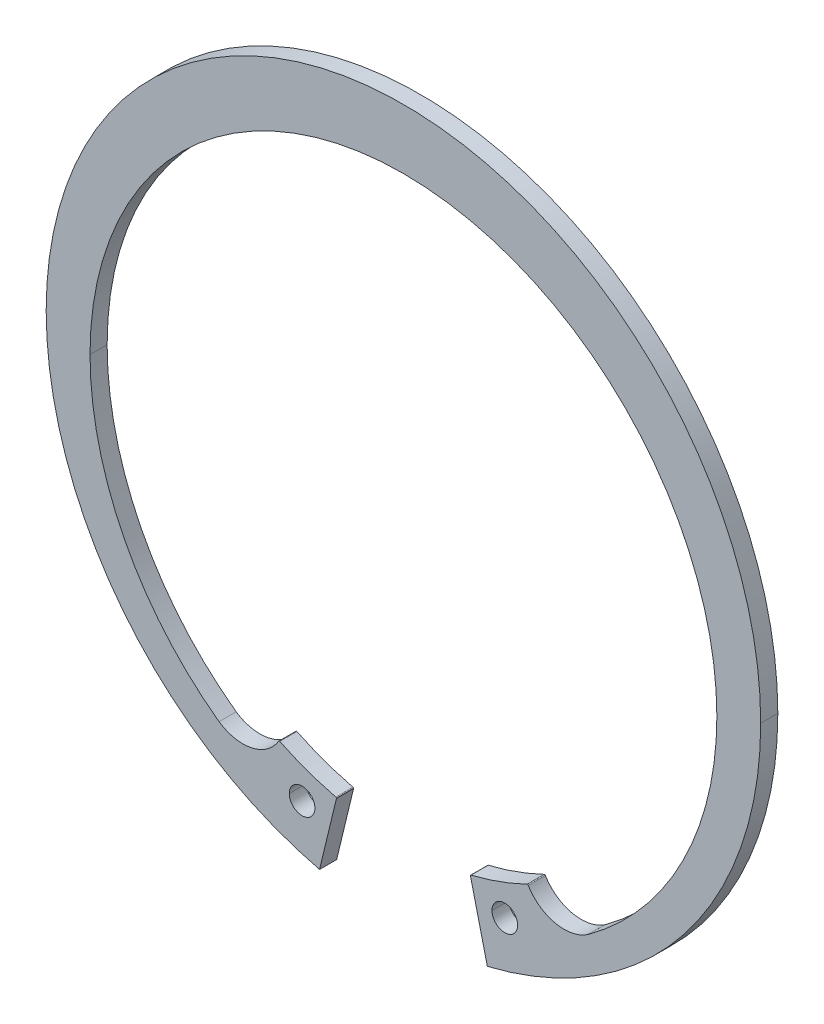
ISO-10303-21;
HEADER;
FILE_DESCRIPTION(('STEP AP214'),'2;1');
FILE_NAME('part.step','',(''),(''),'','','');
FILE_SCHEMA(('AUTOMOTIVE_DESIGN { 1 0 10303 214 1 1 1 1 }'));
ENDSEC;
DATA;
#1=APPLICATION_CONTEXT('core data for automotive mechanical design processes');
#2=APPLICATION_PROTOCOL_DEFINITION('international standard','automotive_design',2000,#1);
#3=PRODUCT_CONTEXT('',#1,'mechanical');
#4=PRODUCT('Part','Part','',(#3));
#5=PRODUCT_RELATED_PRODUCT_CATEGORY('part','',(#4));
#6=PRODUCT_DEFINITION_FORMATION('','',#4);
#7=PRODUCT_DEFINITION_CONTEXT('part definition',#1,'design');
#8=PRODUCT_DEFINITION('design','',#6,#7);
#9=PRODUCT_DEFINITION_SHAPE('','',#8);
#10=(LENGTH_UNIT() NAMED_UNIT(*) SI_UNIT(.MILLI.,.METRE.));
#11=(NAMED_UNIT(*) PLANE_ANGLE_UNIT() SI_UNIT($,.RADIAN.));
#12=(NAMED_UNIT(*) SI_UNIT($,.STERADIAN.) SOLID_ANGLE_UNIT());
#13=UNCERTAINTY_MEASURE_WITH_UNIT(LENGTH_MEASURE(1.E-05),#10,'distance_accuracy_value','');
#14=(GEOMETRIC_REPRESENTATION_CONTEXT(3) GLOBAL_UNCERTAINTY_ASSIGNED_CONTEXT((#13)) GLOBAL_UNIT_ASSIGNED_CONTEXT((#10,
#11,#12)) REPRESENTATION_CONTEXT('',''));
#15=CARTESIAN_POINT('',(0.,0.,0.));
#16=DIRECTION('',(0.,0.,1.));
#17=DIRECTION('',(1.,0.,0.));
#18=AXIS2_PLACEMENT_3D('',#15,#16,#17);
#19=CARTESIAN_POINT('',(-7.9283171314477,-32.3938927494547,-1.99999999999978));
#20=DIRECTION('',(0.,0.,1.));
#21=DIRECTION('',(1.,0.,0.));
#22=AXIS2_PLACEMENT_3D('',#19,#20,#21);
#23=CYLINDRICAL_SURFACE('',#22,0.100000000000003);
#24=DIRECTION('',(0.,0.,1.));
#25=VECTOR('',#24,1.);
#26=CARTESIAN_POINT('',(-7.8283171314477,-32.3938927494543,-1.99999999999978));
#27=LINE('',#26,#25);
#28=CARTESIAN_POINT('',(-7.8283171314477,-32.3938927494543,-1.99999999999978));
#29=VERTEX_POINT('',#28);
#30=CARTESIAN_POINT('',(-7.8283171314477,-32.3938927494547,0.));
#31=VERTEX_POINT('',#30);
#32=EDGE_CURVE('E440',#29,#31,#27,.T.);
#33=ORIENTED_EDGE('',*,*,#32,.F.);
#34=CARTESIAN_POINT('',(-7.9283171314477,-32.3938927494547,-1.99999999999978));
#35=DIRECTION('',(0.,0.,1.));
#36=DIRECTION('',(-1.,0.,0.));
#37=AXIS2_PLACEMENT_3D('',#34,#35,#36);
#38=CIRCLE('',#37,0.100000000000003);
#39=CARTESIAN_POINT('',(-7.90454406658579,-32.2967596377617,-2.00000000000111));
#40=VERTEX_POINT('',#39);
#41=EDGE_CURVE('E373',#29,#40,#38,.T.);
#42=ORIENTED_EDGE('',*,*,#41,.T.);
#43=DIRECTION('',(0.,0.,1.));
#44=VECTOR('',#43,1.);
#45=CARTESIAN_POINT('',(-7.90454406658579,-32.2967596377617,-2.00000000000111));
#46=LINE('',#45,#44);
#47=CARTESIAN_POINT('',(-7.90454406658579,-32.2967596377615,0.));
#48=VERTEX_POINT('',#47);
#49=EDGE_CURVE('E313',#40,#48,#46,.T.);
#50=ORIENTED_EDGE('',*,*,#49,.T.);
#51=CARTESIAN_POINT('',(-7.92831713144771,-32.3938927494547,0.));
#52=DIRECTION('',(0.,0.,1.));
#53=DIRECTION('',(-1.,0.,0.));
#54=AXIS2_PLACEMENT_3D('',#51,#52,#53);
#55=CIRCLE('',#54,0.100000000000003);
#56=EDGE_CURVE('E286',#31,#48,#55,.T.);
#57=ORIENTED_EDGE('',*,*,#56,.F.);
#58=EDGE_LOOP('',(#33,#42,#50,#57));
#59=FACE_BOUND('',#58,.T.);
#60=ADVANCED_FACE('F16',(#59),#23,.T.);
#61=CARTESIAN_POINT('',(-14.4919803074237,-30.0367276308393,-2.00000000000067));
#62=DIRECTION('',(0.,0.,1.));
#63=DIRECTION('',(1.,0.,0.));
#64=AXIS2_PLACEMENT_3D('',#61,#62,#63);
#65=CYLINDRICAL_SURFACE('',#64,0.100000000000005);
#66=CARTESIAN_POINT('',(-14.4919803074237,-30.0367276308384,-4.44089209850063E-13));
#67=DIRECTION('',(0.,0.,1.));
#68=DIRECTION('',(1.,0.,0.));
#69=AXIS2_PLACEMENT_3D('',#66,#67,#68);
#70=CIRCLE('',#69,0.100000000000005);
#71=CARTESIAN_POINT('',(-14.4485260936083,-29.9466624805222,-8.88178419700125E-13));
#72=VERTEX_POINT('',#71);
#73=CARTESIAN_POINT('',(-14.5775096339832,-29.9849132091183,0.));
#74=VERTEX_POINT('',#73);
#75=EDGE_CURVE('E336',#72,#74,#70,.T.);
#76=ORIENTED_EDGE('',*,*,#75,.F.);
#77=DIRECTION('',(0.,0.,1.));
#78=VECTOR('',#77,1.);
#79=CARTESIAN_POINT('',(-14.4485260936083,-29.946662480522,-2.00000000000067));
#80=LINE('',#79,#78);
#81=CARTESIAN_POINT('',(-14.4485260936083,-29.946662480522,-2.00000000000067));
#82=VERTEX_POINT('',#81);
#83=EDGE_CURVE('E306',#82,#72,#80,.T.);
#84=ORIENTED_EDGE('',*,*,#83,.F.);
#85=CARTESIAN_POINT('',(-14.4919803074237,-30.0367276308393,-2.00000000000067));
#86=DIRECTION('',(0.,0.,1.));
#87=DIRECTION('',(1.,0.,0.));
#88=AXIS2_PLACEMENT_3D('',#85,#86,#87);
#89=CIRCLE('',#88,0.100000000000005);
#90=CARTESIAN_POINT('',(-14.5775096339832,-29.9849132091181,-1.99999999999978));
#91=VERTEX_POINT('',#90);
#92=EDGE_CURVE('E347',#82,#91,#89,.T.);
#93=ORIENTED_EDGE('',*,*,#92,.T.);
#94=DIRECTION('',(0.,0.,1.));
#95=VECTOR('',#94,1.);
#96=CARTESIAN_POINT('',(-14.5775096339832,-29.9849132091181,-1.99999999999978));
#97=LINE('',#96,#95);
#98=EDGE_CURVE('E11',#91,#74,#97,.T.);
#99=ORIENTED_EDGE('',*,*,#98,.T.);
#100=EDGE_LOOP('',(#76,#84,#93,#99));
#101=FACE_BOUND('',#100,.T.);
#102=ADVANCED_FACE('F629',(#101),#65,.T.);
#103=CARTESIAN_POINT('',(-18.7741883039646,-27.4425281912447,-2.00000000000067));
#104=DIRECTION('',(0.,0.,1.));
#105=DIRECTION('',(1.,0.,0.));
#106=AXIS2_PLACEMENT_3D('',#103,#104,#105);
#107=CYLINDRICAL_SURFACE('',#106,4.90671309923293);
#108=CARTESIAN_POINT('',(-18.7741883039646,-27.4425281912452,0.));
#109=DIRECTION('',(0.,0.,-1.));
#110=DIRECTION('',(1.,0.,0.));
#111=AXIS2_PLACEMENT_3D('',#108,#109,#110);
#112=CIRCLE('',#111,4.90671309923293);
#113=CARTESIAN_POINT('',(-21.5447012567023,-31.4922308243888,0.));
#114=VERTEX_POINT('',#113);
#115=EDGE_CURVE('E341',#74,#114,#112,.T.);
#116=ORIENTED_EDGE('',*,*,#115,.F.);
#117=ORIENTED_EDGE('',*,*,#98,.F.);
#118=CARTESIAN_POINT('',(-18.7741883039646,-27.4425281912447,-2.00000000000067));
#119=DIRECTION('',(0.,0.,-1.));
#120=DIRECTION('',(1.,0.,0.));
#121=AXIS2_PLACEMENT_3D('',#118,#119,#120);
#122=CIRCLE('',#121,4.90671309923293);
#123=CARTESIAN_POINT('',(-21.5447012567023,-31.4922308243895,-1.99999999999978));
#124=VERTEX_POINT('',#123);
#125=EDGE_CURVE('E265',#91,#124,#122,.T.);
#126=ORIENTED_EDGE('',*,*,#125,.T.);
#127=DIRECTION('',(0.,0.,1.));
#128=VECTOR('',#127,1.);
#129=CARTESIAN_POINT('',(-21.5447012567023,-31.4922308243895,-1.99999999999978));
#130=LINE('',#129,#128);
#131=EDGE_CURVE('E30',#124,#114,#130,.T.);
#132=ORIENTED_EDGE('',*,*,#131,.T.);
#133=EDGE_LOOP('',(#116,#117,#126,#132));
#134=FACE_BOUND('',#133,.T.);
#135=ADVANCED_FACE('F622',(#134),#107,.F.);
#136=CARTESIAN_POINT('',(-23.5736048628727,-34.4579113378789,-2.00000000000067));
#137=DIRECTION('',(-0.825339193721657,0.564637242224496,0.));
#138=DIRECTION('',(0.,0.,1.));
#139=AXIS2_PLACEMENT_3D('',#136,#137,#138);
#140=PLANE('',#139);
#141=DIRECTION('',(-0.564637242224496,-0.825339193721656,0.));
#142=VECTOR('',#141,1.);
#143=CARTESIAN_POINT('',(-23.5736048628727,-34.4579113378789,-2.00000000000067));
#144=LINE('',#143,#142);
#145=CARTESIAN_POINT('',(-21.5460401794114,-31.4941879489048,-1.99999999999978));
#146=VERTEX_POINT('',#145);
#147=EDGE_CURVE('E259',#124,#146,#144,.T.);
#148=ORIENTED_EDGE('',*,*,#147,.T.);
#149=DIRECTION('',(0.,0.,1.));
#150=VECTOR('',#149,1.);
#151=CARTESIAN_POINT('',(-21.5460401794114,-31.4941879489048,-1.99999999999978));
#152=LINE('',#151,#150);
#153=CARTESIAN_POINT('',(-21.5460401794114,-31.4941879489044,-8.88178419700125E-13));
#154=VERTEX_POINT('',#153);
#155=EDGE_CURVE('E256',#146,#154,#152,.T.);
#156=ORIENTED_EDGE('',*,*,#155,.T.);
#157=DIRECTION('',(-0.564637242224496,-0.825339193721656,0.));
#158=VECTOR('',#157,1.);
#159=CARTESIAN_POINT('',(-23.5736048628727,-34.4579113378791,0.));
#160=LINE('',#159,#158);
#161=EDGE_CURVE('E407',#114,#154,#160,.T.);
#162=ORIENTED_EDGE('',*,*,#161,.F.);
#163=ORIENTED_EDGE('',*,*,#131,.F.);
#164=EDGE_LOOP('',(#148,#156,#162,#163));
#165=FACE_BOUND('',#164,.T.);
#166=ADVANCED_FACE('F628',(#165),#140,.T.);
#167=CARTESIAN_POINT('',(0.,2.22044604925031E-13,-1.99999999999978));
#168=DIRECTION('',(0.,0.,1.));
#169=DIRECTION('',(1.,0.,0.));
#170=AXIS2_PLACEMENT_3D('',#167,#168,#169);
#171=CYLINDRICAL_SURFACE('',#170,33.25);
#172=CARTESIAN_POINT('',(0.,0.,0.));
#173=DIRECTION('',(0.,0.,-1.));
#174=DIRECTION('',(1.,0.,0.));
#175=AXIS2_PLACEMENT_3D('',#172,#173,#174);
#176=CIRCLE('',#175,33.25);
#177=EDGE_CURVE('E321',#48,#72,#176,.T.);
#178=ORIENTED_EDGE('',*,*,#177,.F.);
#179=ORIENTED_EDGE('',*,*,#49,.F.);
#180=CARTESIAN_POINT('',(0.,2.22044604925031E-13,-1.99999999999978));
#181=DIRECTION('',(0.,0.,-1.));
#182=DIRECTION('',(1.,0.,0.));
#183=AXIS2_PLACEMENT_3D('',#180,#181,#182);
#184=CIRCLE('',#183,33.25);
#185=EDGE_CURVE('E351',#40,#82,#184,.T.);
#186=ORIENTED_EDGE('',*,*,#185,.T.);
#187=ORIENTED_EDGE('',*,*,#83,.T.);
#188=EDGE_LOOP('',(#178,#179,#186,#187));
#189=FACE_BOUND('',#188,.T.);
#190=ADVANCED_FACE('F788',(#189),#171,.F.);
#191=CARTESIAN_POINT('',(21.5447012567022,-31.4922308243895,-1.99999999999978));
#192=DIRECTION('',(0.825339193721657,0.564637242224496,0.));
#193=DIRECTION('',(0.,0.,-1.));
#194=AXIS2_PLACEMENT_3D('',#191,#192,#193);
#195=PLANE('',#194);
#196=DIRECTION('',(-0.564637242224496,0.825339193721656,0.));
#197=VECTOR('',#196,1.);
#198=CARTESIAN_POINT('',(21.5447012567023,-31.492230824389,-8.88178419700125E-13));
#199=LINE('',#198,#197);
#200=CARTESIAN_POINT('',(21.5460401794114,-31.4941879489041,-8.88178419700125E-13));
#201=VERTEX_POINT('',#200);
#202=CARTESIAN_POINT('',(21.5447012567023,-31.492230824389,-8.88178419700125E-13));
#203=VERTEX_POINT('',#202);
#204=EDGE_CURVE('E142',#201,#203,#199,.T.);
#205=ORIENTED_EDGE('',*,*,#204,.F.);
#206=DIRECTION('',(0.,0.,-1.));
#207=VECTOR('',#206,1.);
#208=CARTESIAN_POINT('',(21.5460401794114,-31.4941879489039,-2.00000000000067));
#209=LINE('',#208,#207);
#210=CARTESIAN_POINT('',(21.5460401794114,-31.4941879489039,-2.00000000000067));
#211=VERTEX_POINT('',#210);
#212=EDGE_CURVE('E307',#201,#211,#209,.T.);
#213=ORIENTED_EDGE('',*,*,#212,.T.);
#214=DIRECTION('',(-0.564637242224496,0.825339193721656,0.));
#215=VECTOR('',#214,1.);
#216=CARTESIAN_POINT('',(21.5447012567022,-31.4922308243895,-1.99999999999978));
#217=LINE('',#216,#215);
#218=CARTESIAN_POINT('',(21.5447012567022,-31.4922308243895,-1.99999999999978));
#219=VERTEX_POINT('',#218);
#220=EDGE_CURVE('E129',#211,#219,#217,.T.);
#221=ORIENTED_EDGE('',*,*,#220,.T.);
#222=DIRECTION('',(0.,0.,1.));
#223=VECTOR('',#222,1.);
#224=CARTESIAN_POINT('',(21.5447012567022,-31.4922308243895,-1.99999999999978));
#225=LINE('',#224,#223);
#226=EDGE_CURVE('E325',#219,#203,#225,.T.);
#227=ORIENTED_EDGE('',*,*,#226,.T.);
#228=EDGE_LOOP('',(#205,#213,#221,#227));
#229=FACE_BOUND('',#228,.T.);
#230=ADVANCED_FACE('F614',(#229),#195,.T.);
#231=CARTESIAN_POINT('',(18.7741883039646,-27.4425281912447,-2.00000000000067));
#232=DIRECTION('',(0.,0.,1.));
#233=DIRECTION('',(1.,0.,0.));
#234=AXIS2_PLACEMENT_3D('',#231,#232,#233);
#235=CYLINDRICAL_SURFACE('',#234,4.90671309923293);
#236=CARTESIAN_POINT('',(18.7741883039646,-27.4425281912445,-8.88178419700125E-13));
#237=DIRECTION('',(0.,0.,-1.));
#238=DIRECTION('',(1.,0.,0.));
#239=AXIS2_PLACEMENT_3D('',#236,#237,#238);
#240=CIRCLE('',#239,4.90671309923293);
#241=CARTESIAN_POINT('',(14.5775096339832,-29.9849132091183,0.));
#242=VERTEX_POINT('',#241);
#243=EDGE_CURVE('E357',#203,#242,#240,.T.);
#244=ORIENTED_EDGE('',*,*,#243,.F.);
#245=ORIENTED_EDGE('',*,*,#226,.F.);
#246=CARTESIAN_POINT('',(18.7741883039646,-27.4425281912447,-2.00000000000067));
#247=DIRECTION('',(0.,0.,-1.));
#248=DIRECTION('',(1.,0.,0.));
#249=AXIS2_PLACEMENT_3D('',#246,#247,#248);
#250=CIRCLE('',#249,4.90671309923293);
#251=CARTESIAN_POINT('',(14.5775096339832,-29.9849132091177,-2.00000000000022));
#252=VERTEX_POINT('',#251);
#253=EDGE_CURVE('E270',#219,#252,#250,.T.);
#254=ORIENTED_EDGE('',*,*,#253,.T.);
#255=DIRECTION('',(0.,0.,1.));
#256=VECTOR('',#255,1.);
#257=CARTESIAN_POINT('',(14.5775096339832,-29.9849132091177,-2.00000000000022));
#258=LINE('',#257,#256);
#259=EDGE_CURVE('E304',#252,#242,#258,.T.);
#260=ORIENTED_EDGE('',*,*,#259,.T.);
#261=EDGE_LOOP('',(#244,#245,#254,#260));
#262=FACE_BOUND('',#261,.T.);
#263=ADVANCED_FACE('F610',(#262),#235,.F.);
#264=CARTESIAN_POINT('',(14.4919803074237,-30.0367276308391,-2.00000000000067));
#265=DIRECTION('',(0.,0.,1.));
#266=DIRECTION('',(1.,0.,0.));
#267=AXIS2_PLACEMENT_3D('',#264,#265,#266);
#268=CYLINDRICAL_SURFACE('',#267,0.100000000000005);
#269=CARTESIAN_POINT('',(14.4919803074237,-30.0367276308386,-4.44089209850063E-13));
#270=DIRECTION('',(0.,0.,1.));
#271=DIRECTION('',(-1.,0.,0.));
#272=AXIS2_PLACEMENT_3D('',#269,#270,#271);
#273=CIRCLE('',#272,0.100000000000005);
#274=CARTESIAN_POINT('',(14.4485260936083,-29.9466624805218,-4.44089209850063E-13));
#275=VERTEX_POINT('',#274);
#276=EDGE_CURVE('E280',#242,#275,#273,.T.);
#277=ORIENTED_EDGE('',*,*,#276,.F.);
#278=ORIENTED_EDGE('',*,*,#259,.F.);
#279=CARTESIAN_POINT('',(14.4919803074237,-30.0367276308391,-2.00000000000067));
#280=DIRECTION('',(0.,0.,1.));
#281=DIRECTION('',(-1.,0.,0.));
#282=AXIS2_PLACEMENT_3D('',#279,#280,#281);
#283=CIRCLE('',#282,0.100000000000005);
#284=CARTESIAN_POINT('',(14.4485260936083,-29.9466624805225,-1.99999999999978));
#285=VERTEX_POINT('',#284);
#286=EDGE_CURVE('E374',#252,#285,#283,.T.);
#287=ORIENTED_EDGE('',*,*,#286,.T.);
#288=DIRECTION('',(0.,0.,1.));
#289=VECTOR('',#288,1.);
#290=CARTESIAN_POINT('',(14.4485260936083,-29.9466624805225,-1.99999999999978));
#291=LINE('',#290,#289);
#292=EDGE_CURVE('E282',#285,#275,#291,.T.);
#293=ORIENTED_EDGE('',*,*,#292,.T.);
#294=EDGE_LOOP('',(#277,#278,#287,#293));
#295=FACE_BOUND('',#294,.T.);
#296=ADVANCED_FACE('F612',(#295),#268,.T.);
#297=CARTESIAN_POINT('',(7.92831713144772,-32.3938927494545,-1.99999999999978));
#298=DIRECTION('',(0.,0.,1.));
#299=DIRECTION('',(1.,0.,0.));
#300=AXIS2_PLACEMENT_3D('',#297,#298,#299);
#301=CYLINDRICAL_SURFACE('',#300,0.0999999999999977);
#302=CARTESIAN_POINT('',(7.92831713144772,-32.3938927494545,-4.44089209850063E-13));
#303=DIRECTION('',(0.,0.,1.));
#304=DIRECTION('',(1.,0.,0.));
#305=AXIS2_PLACEMENT_3D('',#302,#303,#304);
#306=CIRCLE('',#305,0.0999999999999977);
#307=CARTESIAN_POINT('',(7.90454406658581,-32.2967596377626,0.));
#308=VERTEX_POINT('',#307);
#309=CARTESIAN_POINT('',(7.83111317286561,-32.4173744537364,0.));
#310=VERTEX_POINT('',#309);
#311=EDGE_CURVE('E277',#308,#310,#306,.T.);
#312=ORIENTED_EDGE('',*,*,#311,.F.);
#313=DIRECTION('',(0.,0.,1.));
#314=VECTOR('',#313,1.);
#315=CARTESIAN_POINT('',(7.90454406658581,-32.2967596377626,-2.00000000000067));
#316=LINE('',#315,#314);
#317=CARTESIAN_POINT('',(7.90454406658581,-32.2967596377626,-2.00000000000067));
#318=VERTEX_POINT('',#317);
#319=EDGE_CURVE('E285',#318,#308,#316,.T.);
#320=ORIENTED_EDGE('',*,*,#319,.F.);
#321=CARTESIAN_POINT('',(7.92831713144772,-32.3938927494545,-1.99999999999978));
#322=DIRECTION('',(0.,0.,1.));
#323=DIRECTION('',(1.,0.,0.));
#324=AXIS2_PLACEMENT_3D('',#321,#322,#323);
#325=CIRCLE('',#324,0.0999999999999977);
#326=CARTESIAN_POINT('',(7.83111317286561,-32.4173744537357,-2.00000000000067));
#327=VERTEX_POINT('',#326);
#328=EDGE_CURVE('E367',#318,#327,#325,.T.);
#329=ORIENTED_EDGE('',*,*,#328,.T.);
#330=DIRECTION('',(0.,0.,1.));
#331=VECTOR('',#330,1.);
#332=CARTESIAN_POINT('',(7.83111317286561,-32.4173744537357,-2.00000000000067));
#333=LINE('',#332,#331);
#334=EDGE_CURVE('E217',#327,#310,#333,.T.);
#335=ORIENTED_EDGE('',*,*,#334,.T.);
#336=EDGE_LOOP('',(#312,#320,#329,#335));
#337=FACE_BOUND('',#336,.T.);
#338=ADVANCED_FACE('F483',(#337),#301,.T.);
#339=CARTESIAN_POINT('',(0.,2.22044604925031E-13,-1.99999999999978));
#340=DIRECTION('',(0.,0.,1.));
#341=DIRECTION('',(1.,0.,0.));
#342=AXIS2_PLACEMENT_3D('',#339,#340,#341);
#343=CYLINDRICAL_SURFACE('',#342,33.25);
#344=CARTESIAN_POINT('',(0.,0.,0.));
#345=DIRECTION('',(0.,0.,-1.));
#346=DIRECTION('',(1.,0.,0.));
#347=AXIS2_PLACEMENT_3D('',#344,#345,#346);
#348=CIRCLE('',#347,33.25);
#349=EDGE_CURVE('E275',#275,#308,#348,.T.);
#350=ORIENTED_EDGE('',*,*,#349,.F.);
#351=ORIENTED_EDGE('',*,*,#292,.F.);
#352=CARTESIAN_POINT('',(0.,2.22044604925031E-13,-1.99999999999978));
#353=DIRECTION('',(0.,0.,-1.));
#354=DIRECTION('',(1.,0.,0.));
#355=AXIS2_PLACEMENT_3D('',#352,#353,#354);
#356=CIRCLE('',#355,33.25);
#357=EDGE_CURVE('E375',#285,#318,#356,.T.);
#358=ORIENTED_EDGE('',*,*,#357,.T.);
#359=ORIENTED_EDGE('',*,*,#319,.T.);
#360=EDGE_LOOP('',(#350,#351,#358,#359));
#361=FACE_BOUND('',#360,.T.);
#362=ADVANCED_FACE('F487',(#361),#343,.F.);
#363=CARTESIAN_POINT('',(-11.8442150949292,-34.6569645783501,-2.00000000000067));
#364=DIRECTION('',(0.,0.,1.));
#365=DIRECTION('',(1.,0.,0.));
#366=AXIS2_PLACEMENT_3D('',#363,#364,#365);
#367=CYLINDRICAL_SURFACE('',#366,1.5);
#368=DIRECTION('',(0.,0.,1.));
#369=VECTOR('',#368,1.);
#370=CARTESIAN_POINT('',(-13.3442150949292,-34.6569645783508,-2.00000000000067));
#371=LINE('',#370,#369);
#372=CARTESIAN_POINT('',(-13.3442150949292,-34.6569645783508,-2.00000000000067));
#373=VERTEX_POINT('',#372);
#374=CARTESIAN_POINT('',(-13.3442150949292,-34.6569645783505,-8.88178419700125E-13));
#375=VERTEX_POINT('',#374);
#376=EDGE_CURVE('E292',#373,#375,#371,.T.);
#377=ORIENTED_EDGE('',*,*,#376,.F.);
#378=CARTESIAN_POINT('',(-11.8442150949292,-34.6569645783501,-2.00000000000067));
#379=DIRECTION('',(0.,0.,1.));
#380=DIRECTION('',(1.,0.,0.));
#381=AXIS2_PLACEMENT_3D('',#378,#379,#380);
#382=CIRCLE('',#381,1.5);
#383=CARTESIAN_POINT('',(-10.3442150949292,-34.6569645783503,-2.00000000000022));
#384=VERTEX_POINT('',#383);
#385=EDGE_CURVE('E271',#384,#373,#382,.T.);
#386=ORIENTED_EDGE('',*,*,#385,.F.);
#387=DIRECTION('',(0.,0.,1.));
#388=VECTOR('',#387,1.);
#389=CARTESIAN_POINT('',(-10.3442150949292,-34.6569645783503,-2.00000000000022));
#390=LINE('',#389,#388);
#391=CARTESIAN_POINT('',(-10.3442150949292,-34.6569645783501,0.));
#392=VERTEX_POINT('',#391);
#393=EDGE_CURVE('E320',#384,#392,#390,.T.);
#394=ORIENTED_EDGE('',*,*,#393,.T.);
#395=CARTESIAN_POINT('',(-11.8442150949292,-34.6569645783501,-4.44089209850063E-13));
#396=DIRECTION('',(0.,0.,1.));
#397=DIRECTION('',(1.,0.,0.));
#398=AXIS2_PLACEMENT_3D('',#395,#396,#397);
#399=CIRCLE('',#398,1.5);
#400=EDGE_CURVE('E287',#392,#375,#399,.T.);
#401=ORIENTED_EDGE('',*,*,#400,.T.);
#402=EDGE_LOOP('',(#377,#386,#394,#401));
#403=FACE_BOUND('',#402,.T.);
#404=ADVANCED_FACE('F555',(#403),#367,.F.);
#405=CARTESIAN_POINT('',(11.8442150949292,-34.6569645783501,-2.00000000000067));
#406=DIRECTION('',(0.,0.,1.));
#407=DIRECTION('',(1.,0.,0.));
#408=AXIS2_PLACEMENT_3D('',#405,#406,#407);
#409=CYLINDRICAL_SURFACE('',#408,1.5);
#410=DIRECTION('',(0.,0.,1.));
#411=VECTOR('',#410,1.);
#412=CARTESIAN_POINT('',(10.3442150949292,-34.6569645783501,-2.00000000000111));
#413=LINE('',#412,#411);
#414=CARTESIAN_POINT('',(10.3442150949292,-34.6569645783501,-2.00000000000111));
#415=VERTEX_POINT('',#414);
#416=CARTESIAN_POINT('',(10.3442150949292,-34.6569645783503,0.));
#417=VERTEX_POINT('',#416);
#418=EDGE_CURVE('E316',#415,#417,#413,.T.);
#419=ORIENTED_EDGE('',*,*,#418,.F.);
#420=CARTESIAN_POINT('',(11.8442150949292,-34.6569645783501,-2.00000000000067));
#421=DIRECTION('',(0.,0.,1.));
#422=DIRECTION('',(1.,0.,0.));
#423=AXIS2_PLACEMENT_3D('',#420,#421,#422);
#424=CIRCLE('',#423,1.5);
#425=CARTESIAN_POINT('',(13.3442150949292,-34.6569645783501,-2.00000000000067));
#426=VERTEX_POINT('',#425);
#427=EDGE_CURVE('E266',#426,#415,#424,.T.);
#428=ORIENTED_EDGE('',*,*,#427,.F.);
#429=DIRECTION('',(0.,0.,1.));
#430=VECTOR('',#429,1.);
#431=CARTESIAN_POINT('',(13.3442150949292,-34.6569645783501,-2.00000000000067));
#432=LINE('',#431,#430);
#433=CARTESIAN_POINT('',(13.3442150949292,-34.6569645783505,0.));
#434=VERTEX_POINT('',#433);
#435=EDGE_CURVE('E324',#426,#434,#432,.T.);
#436=ORIENTED_EDGE('',*,*,#435,.T.);
#437=CARTESIAN_POINT('',(11.8442150949292,-34.6569645783508,0.));
#438=DIRECTION('',(0.,0.,1.));
#439=DIRECTION('',(1.,0.,0.));
#440=AXIS2_PLACEMENT_3D('',#437,#438,#439);
#441=CIRCLE('',#440,1.5);
#442=EDGE_CURVE('E346',#434,#417,#441,.T.);
#443=ORIENTED_EDGE('',*,*,#442,.T.);
#444=EDGE_LOOP('',(#419,#428,#436,#443));
#445=FACE_BOUND('',#444,.T.);
#446=ADVANCED_FACE('F596',(#445),#409,.F.);
#447=CARTESIAN_POINT('',(0.,0.,0.));
#448=DIRECTION('',(0.,0.,1.));
#449=DIRECTION('',(1.,0.,0.));
#450=AXIS2_PLACEMENT_3D('',#447,#448,#449);
#451=PLANE('',#450);
#452=ORIENTED_EDGE('',*,*,#400,.F.);
#453=CARTESIAN_POINT('',(-11.8442150949292,-34.6569645783501,-4.44089209850063E-13));
#454=DIRECTION('',(0.,0.,1.));
#455=DIRECTION('',(1.,0.,0.));
#456=AXIS2_PLACEMENT_3D('',#453,#454,#455);
#457=CIRCLE('',#456,1.5);
#458=EDGE_CURVE('E405',#375,#392,#457,.T.);
#459=ORIENTED_EDGE('',*,*,#458,.F.);
#460=EDGE_LOOP('',(#452,#459));
#461=FACE_BOUND('',#460,.T.);
#462=ORIENTED_EDGE('',*,*,#442,.F.);
#463=CARTESIAN_POINT('',(11.8442150949292,-34.6569645783508,0.));
#464=DIRECTION('',(0.,0.,1.));
#465=DIRECTION('',(1.,0.,0.));
#466=AXIS2_PLACEMENT_3D('',#463,#464,#465);
#467=CIRCLE('',#466,1.5);
#468=EDGE_CURVE('E328',#417,#434,#467,.T.);
#469=ORIENTED_EDGE('',*,*,#468,.F.);
#470=EDGE_LOOP('',(#462,#469));
#471=FACE_BOUND('',#470,.T.);
#472=ORIENTED_EDGE('',*,*,#161,.T.);
#473=CARTESIAN_POINT('',(0.,-1.8760379564573,-4.44089209850063E-13));
#474=DIRECTION('',(0.,0.,-1.));
#475=DIRECTION('',(1.,0.,0.));
#476=AXIS2_PLACEMENT_3D('',#473,#474,#475);
#477=CIRCLE('',#476,36.626037956458);
#478=CARTESIAN_POINT('',(-36.626037956458,-1.87603795645774,0.));
#479=VERTEX_POINT('',#478);
#480=EDGE_CURVE('E281',#154,#479,#477,.T.);
#481=ORIENTED_EDGE('',*,*,#480,.T.);
#482=CARTESIAN_POINT('',(0.,-1.8760379564573,-4.44089209850063E-13));
#483=DIRECTION('',(0.,0.,-1.));
#484=DIRECTION('',(1.,0.,0.));
#485=AXIS2_PLACEMENT_3D('',#482,#483,#484);
#486=CIRCLE('',#485,36.626037956458);
#487=CARTESIAN_POINT('',(36.626037956458,-1.87603795645774,0.));
#488=VERTEX_POINT('',#487);
#489=EDGE_CURVE('E298',#479,#488,#486,.T.);
#490=ORIENTED_EDGE('',*,*,#489,.T.);
#491=CARTESIAN_POINT('',(0.,-1.8760379564573,-4.44089209850063E-13));
#492=DIRECTION('',(0.,0.,-1.));
#493=DIRECTION('',(1.,0.,0.));
#494=AXIS2_PLACEMENT_3D('',#491,#492,#493);
#495=CIRCLE('',#494,36.626037956458);
#496=EDGE_CURVE('E386',#488,#201,#495,.T.);
#497=ORIENTED_EDGE('',*,*,#496,.T.);
#498=ORIENTED_EDGE('',*,*,#204,.T.);
#499=ORIENTED_EDGE('',*,*,#243,.T.);
#500=ORIENTED_EDGE('',*,*,#276,.T.);
#501=ORIENTED_EDGE('',*,*,#349,.T.);
#502=ORIENTED_EDGE('',*,*,#311,.T.);
#503=DIRECTION('',(0.234817042815552,-0.972039585821152,0.));
#504=VECTOR('',#503,1.);
#505=CARTESIAN_POINT('',(9.80361153754931,-40.5826527080329,-8.88178419700125E-13));
#506=LINE('',#505,#504);
#507=CARTESIAN_POINT('',(9.80361153754931,-40.5826527080329,-8.88178419700125E-13));
#508=VERTEX_POINT('',#507);
#509=EDGE_CURVE('E358',#310,#508,#506,.T.);
#510=ORIENTED_EDGE('',*,*,#509,.T.);
#511=CARTESIAN_POINT('',(0.,0.,0.));
#512=DIRECTION('',(0.,0.,1.));
#513=DIRECTION('',(1.,0.,0.));
#514=AXIS2_PLACEMENT_3D('',#511,#512,#513);
#515=CIRCLE('',#514,41.75);
#516=CARTESIAN_POINT('',(41.75,6.66133814775094E-13,-4.44089209850063E-13));
#517=VERTEX_POINT('',#516);
#518=EDGE_CURVE('E228',#508,#517,#515,.T.);
#519=ORIENTED_EDGE('',*,*,#518,.T.);
#520=CARTESIAN_POINT('',(0.,0.,0.));
#521=DIRECTION('',(0.,0.,1.));
#522=DIRECTION('',(1.,0.,0.));
#523=AXIS2_PLACEMENT_3D('',#520,#521,#522);
#524=CIRCLE('',#523,41.75);
#525=CARTESIAN_POINT('',(-41.75,0.,0.));
#526=VERTEX_POINT('',#525);
#527=EDGE_CURVE('E249',#517,#526,#524,.T.);
#528=ORIENTED_EDGE('',*,*,#527,.T.);
#529=CARTESIAN_POINT('',(0.,0.,0.));
#530=DIRECTION('',(0.,0.,1.));
#531=DIRECTION('',(1.,0.,0.));
#532=AXIS2_PLACEMENT_3D('',#529,#530,#531);
#533=CIRCLE('',#532,41.75);
#534=CARTESIAN_POINT('',(-9.80361153754931,-40.5826527080324,-1.33226762955019E-12));
#535=VERTEX_POINT('',#534);
#536=EDGE_CURVE('E361',#526,#535,#533,.T.);
#537=ORIENTED_EDGE('',*,*,#536,.T.);
#538=DIRECTION('',(0.234817042815552,0.972039585821152,0.));
#539=VECTOR('',#538,1.);
#540=CARTESIAN_POINT('',(-9.80361153754931,-40.5826527080324,-1.33226762955019E-12));
#541=LINE('',#540,#539);
#542=CARTESIAN_POINT('',(-7.83111317286559,-32.4173744537364,0.));
#543=VERTEX_POINT('',#542);
#544=EDGE_CURVE('E368',#535,#543,#541,.T.);
#545=ORIENTED_EDGE('',*,*,#544,.T.);
#546=CARTESIAN_POINT('',(-7.92831713144771,-32.3938927494547,0.));
#547=DIRECTION('',(0.,0.,1.));
#548=DIRECTION('',(-1.,0.,0.));
#549=AXIS2_PLACEMENT_3D('',#546,#547,#548);
#550=CIRCLE('',#549,0.100000000000003);
#551=EDGE_CURVE('E457',#543,#31,#550,.T.);
#552=ORIENTED_EDGE('',*,*,#551,.T.);
#553=ORIENTED_EDGE('',*,*,#56,.T.);
#554=ORIENTED_EDGE('',*,*,#177,.T.);
#555=ORIENTED_EDGE('',*,*,#75,.T.);
#556=ORIENTED_EDGE('',*,*,#115,.T.);
#557=EDGE_LOOP('',(#472,#481,#490,#497,#498,#499,#500,#501,#502,#510,#519,#528,#537,#545,#552,
#553,#554,#555,#556));
#558=FACE_BOUND('',#557,.T.);
#559=ADVANCED_FACE('F484',(#461,#471,#558),#451,.T.);
#560=CARTESIAN_POINT('',(0.,2.22044604925031E-13,-1.99999999999978));
#561=DIRECTION('',(0.,0.,1.));
#562=DIRECTION('',(1.,0.,0.));
#563=AXIS2_PLACEMENT_3D('',#560,#561,#562);
#564=PLANE('',#563);
#565=ORIENTED_EDGE('',*,*,#385,.T.);
#566=CARTESIAN_POINT('',(-11.8442150949292,-34.6569645783501,-2.00000000000067));
#567=DIRECTION('',(0.,0.,1.));
#568=DIRECTION('',(1.,0.,0.));
#569=AXIS2_PLACEMENT_3D('',#566,#567,#568);
#570=CIRCLE('',#569,1.5);
#571=EDGE_CURVE('E288',#373,#384,#570,.T.);
#572=ORIENTED_EDGE('',*,*,#571,.T.);
#573=EDGE_LOOP('',(#565,#572));
#574=FACE_BOUND('',#573,.T.);
#575=ORIENTED_EDGE('',*,*,#427,.T.);
#576=CARTESIAN_POINT('',(11.8442150949292,-34.6569645783501,-2.00000000000067));
#577=DIRECTION('',(0.,0.,1.));
#578=DIRECTION('',(1.,0.,0.));
#579=AXIS2_PLACEMENT_3D('',#576,#577,#578);
#580=CIRCLE('',#579,1.5);
#581=EDGE_CURVE('E315',#415,#426,#580,.T.);
#582=ORIENTED_EDGE('',*,*,#581,.T.);
#583=EDGE_LOOP('',(#575,#582));
#584=FACE_BOUND('',#583,.T.);
#585=CARTESIAN_POINT('',(0.,-1.8760379564573,-2.00000000000022));
#586=DIRECTION('',(0.,0.,-1.));
#587=DIRECTION('',(1.,0.,0.));
#588=AXIS2_PLACEMENT_3D('',#585,#586,#587);
#589=CIRCLE('',#588,36.626037956458);
#590=CARTESIAN_POINT('',(-36.626037956458,-1.87603795645774,-1.99999999999978));
#591=VERTEX_POINT('',#590);
#592=EDGE_CURVE('E20',#146,#591,#589,.T.);
#593=ORIENTED_EDGE('',*,*,#592,.F.);
#594=ORIENTED_EDGE('',*,*,#147,.F.);
#595=ORIENTED_EDGE('',*,*,#125,.F.);
#596=ORIENTED_EDGE('',*,*,#92,.F.);
#597=ORIENTED_EDGE('',*,*,#185,.F.);
#598=ORIENTED_EDGE('',*,*,#41,.F.);
#599=CARTESIAN_POINT('',(-7.9283171314477,-32.3938927494547,-1.99999999999978));
#600=DIRECTION('',(0.,0.,1.));
#601=DIRECTION('',(-1.,0.,0.));
#602=AXIS2_PLACEMENT_3D('',#599,#600,#601);
#603=CIRCLE('',#602,0.100000000000003);
#604=CARTESIAN_POINT('',(-7.83111317286559,-32.4173744537359,-2.00000000000067));
#605=VERTEX_POINT('',#604);
#606=EDGE_CURVE('E432',#605,#29,#603,.T.);
#607=ORIENTED_EDGE('',*,*,#606,.F.);
#608=DIRECTION('',(0.234817042815552,0.972039585821152,0.));
#609=VECTOR('',#608,1.);
#610=CARTESIAN_POINT('',(-9.80361153754931,-40.5826527080331,-1.99999999999978));
#611=LINE('',#610,#609);
#612=CARTESIAN_POINT('',(-9.80361153754931,-40.5826527080331,-1.99999999999978));
#613=VERTEX_POINT('',#612);
#614=EDGE_CURVE('E263',#613,#605,#611,.T.);
#615=ORIENTED_EDGE('',*,*,#614,.F.);
#616=CARTESIAN_POINT('',(0.,2.22044604925031E-13,-1.99999999999978));
#617=DIRECTION('',(0.,0.,1.));
#618=DIRECTION('',(1.,0.,0.));
#619=AXIS2_PLACEMENT_3D('',#616,#617,#618);
#620=CIRCLE('',#619,41.75);
#621=CARTESIAN_POINT('',(-41.75,2.22044604925031E-13,-1.99999999999978));
#622=VERTEX_POINT('',#621);
#623=EDGE_CURVE('E232',#622,#613,#620,.T.);
#624=ORIENTED_EDGE('',*,*,#623,.F.);
#625=CARTESIAN_POINT('',(0.,2.22044604925031E-13,-1.99999999999978));
#626=DIRECTION('',(0.,0.,1.));
#627=DIRECTION('',(1.,0.,0.));
#628=AXIS2_PLACEMENT_3D('',#625,#626,#627);
#629=CIRCLE('',#628,41.75);
#630=CARTESIAN_POINT('',(41.75,4.44089209850063E-13,-2.00000000000067));
#631=VERTEX_POINT('',#630);
#632=EDGE_CURVE('E238',#631,#622,#629,.T.);
#633=ORIENTED_EDGE('',*,*,#632,.F.);
#634=CARTESIAN_POINT('',(0.,2.22044604925031E-13,-1.99999999999978));
#635=DIRECTION('',(0.,0.,1.));
#636=DIRECTION('',(1.,0.,0.));
#637=AXIS2_PLACEMENT_3D('',#634,#635,#636);
#638=CIRCLE('',#637,41.75);
#639=CARTESIAN_POINT('',(9.80361153754931,-40.5826527080326,-2.00000000000067));
#640=VERTEX_POINT('',#639);
#641=EDGE_CURVE('E227',#640,#631,#638,.T.);
#642=ORIENTED_EDGE('',*,*,#641,.F.);
#643=DIRECTION('',(0.234817042815552,-0.972039585821152,0.));
#644=VECTOR('',#643,1.);
#645=CARTESIAN_POINT('',(9.80361153754931,-40.5826527080326,-2.00000000000067));
#646=LINE('',#645,#644);
#647=EDGE_CURVE('E211',#327,#640,#646,.T.);
#648=ORIENTED_EDGE('',*,*,#647,.F.);
#649=ORIENTED_EDGE('',*,*,#328,.F.);
#650=ORIENTED_EDGE('',*,*,#357,.F.);
#651=ORIENTED_EDGE('',*,*,#286,.F.);
#652=ORIENTED_EDGE('',*,*,#253,.F.);
#653=ORIENTED_EDGE('',*,*,#220,.F.);
#654=CARTESIAN_POINT('',(0.,-1.8760379564573,-2.00000000000022));
#655=DIRECTION('',(0.,0.,-1.));
#656=DIRECTION('',(1.,0.,0.));
#657=AXIS2_PLACEMENT_3D('',#654,#655,#656);
#658=CIRCLE('',#657,36.626037956458);
#659=CARTESIAN_POINT('',(36.626037956458,-1.87603795645752,-2.00000000000067));
#660=VERTEX_POINT('',#659);
#661=EDGE_CURVE('E225',#660,#211,#658,.T.);
#662=ORIENTED_EDGE('',*,*,#661,.F.);
#663=CARTESIAN_POINT('',(0.,-1.8760379564573,-2.00000000000022));
#664=DIRECTION('',(0.,0.,-1.));
#665=DIRECTION('',(1.,0.,0.));
#666=AXIS2_PLACEMENT_3D('',#663,#664,#665);
#667=CIRCLE('',#666,36.626037956458);
#668=EDGE_CURVE('E251',#591,#660,#667,.T.);
#669=ORIENTED_EDGE('',*,*,#668,.F.);
#670=EDGE_LOOP('',(#593,#594,#595,#596,#597,#598,#607,#615,#624,#633,#642,#648,#649,#650,#651,
#652,#653,#662,#669));
#671=FACE_BOUND('',#670,.T.);
#672=ADVANCED_FACE('F233',(#574,#584,#671),#564,.F.);
#673=CARTESIAN_POINT('',(-9.80361153754931,-40.5826527080331,-1.99999999999978));
#674=DIRECTION('',(0.972039585821153,-0.234817042815552,0.));
#675=DIRECTION('',(0.,0.,-1.));
#676=AXIS2_PLACEMENT_3D('',#673,#674,#675);
#677=PLANE('',#676);
#678=ORIENTED_EDGE('',*,*,#544,.F.);
#679=DIRECTION('',(0.,0.,1.));
#680=VECTOR('',#679,1.);
#681=CARTESIAN_POINT('',(-9.80361153754931,-40.5826527080331,-1.99999999999978));
#682=LINE('',#681,#680);
#683=EDGE_CURVE('E429',#613,#535,#682,.T.);
#684=ORIENTED_EDGE('',*,*,#683,.F.);
#685=ORIENTED_EDGE('',*,*,#614,.T.);
#686=DIRECTION('',(0.,0.,1.));
#687=VECTOR('',#686,1.);
#688=CARTESIAN_POINT('',(-7.83111317286559,-32.4173744537359,-2.00000000000067));
#689=LINE('',#688,#687);
#690=EDGE_CURVE('E294',#605,#543,#689,.T.);
#691=ORIENTED_EDGE('',*,*,#690,.T.);
#692=EDGE_LOOP('',(#678,#684,#685,#691));
#693=FACE_BOUND('',#692,.T.);
#694=ADVANCED_FACE('F508',(#693),#677,.T.);
#695=CARTESIAN_POINT('',(0.,-1.8760379564573,-2.00000000000022));
#696=DIRECTION('',(0.,0.,1.));
#697=DIRECTION('',(1.,0.,0.));
#698=AXIS2_PLACEMENT_3D('',#695,#696,#697);
#699=CYLINDRICAL_SURFACE('',#698,36.626037956458);
#700=DIRECTION('',(0.,0.,1.));
#701=VECTOR('',#700,1.);
#702=CARTESIAN_POINT('',(36.626037956458,-1.87603795645752,-2.00000000000067));
#703=LINE('',#702,#701);
#704=EDGE_CURVE('E260',#660,#488,#703,.T.);
#705=ORIENTED_EDGE('',*,*,#704,.F.);
#706=ORIENTED_EDGE('',*,*,#661,.T.);
#707=ORIENTED_EDGE('',*,*,#212,.F.);
#708=ORIENTED_EDGE('',*,*,#496,.F.);
#709=EDGE_LOOP('',(#705,#706,#707,#708));
#710=FACE_BOUND('',#709,.T.);
#711=ADVANCED_FACE('F562',(#710),#699,.F.);
#712=CARTESIAN_POINT('',(9.80361153754931,-40.5826527080326,-2.00000000000067));
#713=DIRECTION('',(-0.972039585821153,-0.234817042815552,0.));
#714=DIRECTION('',(-0.234817042815552,0.972039585821152,0.));
#715=AXIS2_PLACEMENT_3D('',#712,#713,#714);
#716=PLANE('',#715);
#717=ORIENTED_EDGE('',*,*,#509,.F.);
#718=ORIENTED_EDGE('',*,*,#334,.F.);
#719=ORIENTED_EDGE('',*,*,#647,.T.);
#720=DIRECTION('',(0.,0.,1.));
#721=VECTOR('',#720,1.);
#722=CARTESIAN_POINT('',(9.80361153754931,-40.5826527080326,-2.00000000000067));
#723=LINE('',#722,#721);
#724=EDGE_CURVE('E214',#640,#508,#723,.T.);
#725=ORIENTED_EDGE('',*,*,#724,.T.);
#726=EDGE_LOOP('',(#717,#718,#719,#725));
#727=FACE_BOUND('',#726,.T.);
#728=ADVANCED_FACE('F212',(#727),#716,.T.);
#729=CARTESIAN_POINT('',(0.,2.22044604925031E-13,-1.99999999999978));
#730=DIRECTION('',(0.,0.,1.));
#731=DIRECTION('',(1.,0.,0.));
#732=AXIS2_PLACEMENT_3D('',#729,#730,#731);
#733=CYLINDRICAL_SURFACE('',#732,41.75);
#734=DIRECTION('',(0.,0.,1.));
#735=VECTOR('',#734,1.);
#736=CARTESIAN_POINT('',(-41.75,2.22044604925031E-13,-1.99999999999978));
#737=LINE('',#736,#735);
#738=EDGE_CURVE('E297',#622,#526,#737,.T.);
#739=ORIENTED_EDGE('',*,*,#738,.F.);
#740=ORIENTED_EDGE('',*,*,#623,.T.);
#741=ORIENTED_EDGE('',*,*,#683,.T.);
#742=ORIENTED_EDGE('',*,*,#536,.F.);
#743=EDGE_LOOP('',(#739,#740,#741,#742));
#744=FACE_BOUND('',#743,.T.);
#745=ADVANCED_FACE('F18',(#744),#733,.T.);
#746=CARTESIAN_POINT('',(0.,2.22044604925031E-13,-1.99999999999978));
#747=DIRECTION('',(0.,0.,1.));
#748=DIRECTION('',(1.,0.,0.));
#749=AXIS2_PLACEMENT_3D('',#746,#747,#748);
#750=CYLINDRICAL_SURFACE('',#749,41.75);
#751=ORIENTED_EDGE('',*,*,#641,.T.);
#752=DIRECTION('',(0.,0.,1.));
#753=VECTOR('',#752,1.);
#754=CARTESIAN_POINT('',(41.75,4.44089209850063E-13,-2.00000000000067));
#755=LINE('',#754,#753);
#756=EDGE_CURVE('E239',#631,#517,#755,.T.);
#757=ORIENTED_EDGE('',*,*,#756,.T.);
#758=ORIENTED_EDGE('',*,*,#518,.F.);
#759=ORIENTED_EDGE('',*,*,#724,.F.);
#760=EDGE_LOOP('',(#751,#757,#758,#759));
#761=FACE_BOUND('',#760,.T.);
#762=ADVANCED_FACE('F223',(#761),#750,.T.);
#763=CARTESIAN_POINT('',(0.,2.22044604925031E-13,-1.99999999999978));
#764=DIRECTION('',(0.,0.,1.));
#765=DIRECTION('',(1.,0.,0.));
#766=AXIS2_PLACEMENT_3D('',#763,#764,#765);
#767=CYLINDRICAL_SURFACE('',#766,41.75);
#768=ORIENTED_EDGE('',*,*,#632,.T.);
#769=ORIENTED_EDGE('',*,*,#738,.T.);
#770=ORIENTED_EDGE('',*,*,#527,.F.);
#771=ORIENTED_EDGE('',*,*,#756,.F.);
#772=EDGE_LOOP('',(#768,#769,#770,#771));
#773=FACE_BOUND('',#772,.T.);
#774=ADVANCED_FACE('F520',(#773),#767,.T.);
#775=CARTESIAN_POINT('',(0.,-1.8760379564573,-2.00000000000022));
#776=DIRECTION('',(0.,0.,1.));
#777=DIRECTION('',(1.,0.,0.));
#778=AXIS2_PLACEMENT_3D('',#775,#776,#777);
#779=CYLINDRICAL_SURFACE('',#778,36.626037956458);
#780=DIRECTION('',(0.,0.,1.));
#781=VECTOR('',#780,1.);
#782=CARTESIAN_POINT('',(-36.626037956458,-1.87603795645774,-1.99999999999978));
#783=LINE('',#782,#781);
#784=EDGE_CURVE('E337',#591,#479,#783,.T.);
#785=ORIENTED_EDGE('',*,*,#784,.F.);
#786=ORIENTED_EDGE('',*,*,#668,.T.);
#787=ORIENTED_EDGE('',*,*,#704,.T.);
#788=ORIENTED_EDGE('',*,*,#489,.F.);
#789=EDGE_LOOP('',(#785,#786,#787,#788));
#790=FACE_BOUND('',#789,.T.);
#791=ADVANCED_FACE('F652',(#790),#779,.F.);
#792=CARTESIAN_POINT('',(0.,-1.8760379564573,-2.00000000000022));
#793=DIRECTION('',(0.,0.,1.));
#794=DIRECTION('',(1.,0.,0.));
#795=AXIS2_PLACEMENT_3D('',#792,#793,#794);
#796=CYLINDRICAL_SURFACE('',#795,36.626037956458);
#797=ORIENTED_EDGE('',*,*,#592,.T.);
#798=ORIENTED_EDGE('',*,*,#784,.T.);
#799=ORIENTED_EDGE('',*,*,#480,.F.);
#800=ORIENTED_EDGE('',*,*,#155,.F.);
#801=EDGE_LOOP('',(#797,#798,#799,#800));
#802=FACE_BOUND('',#801,.T.);
#803=ADVANCED_FACE('F583',(#802),#796,.F.);
#804=CARTESIAN_POINT('',(11.8442150949292,-34.6569645783501,-2.00000000000067));
#805=DIRECTION('',(0.,0.,1.));
#806=DIRECTION('',(1.,0.,0.));
#807=AXIS2_PLACEMENT_3D('',#804,#805,#806);
#808=CYLINDRICAL_SURFACE('',#807,1.5);
#809=ORIENTED_EDGE('',*,*,#581,.F.);
#810=ORIENTED_EDGE('',*,*,#418,.T.);
#811=ORIENTED_EDGE('',*,*,#468,.T.);
#812=ORIENTED_EDGE('',*,*,#435,.F.);
#813=EDGE_LOOP('',(#809,#810,#811,#812));
#814=FACE_BOUND('',#813,.T.);
#815=ADVANCED_FACE('F574',(#814),#808,.F.);
#816=CARTESIAN_POINT('',(-11.8442150949292,-34.6569645783501,-2.00000000000067));
#817=DIRECTION('',(0.,0.,1.));
#818=DIRECTION('',(1.,0.,0.));
#819=AXIS2_PLACEMENT_3D('',#816,#817,#818);
#820=CYLINDRICAL_SURFACE('',#819,1.5);
#821=ORIENTED_EDGE('',*,*,#571,.F.);
#822=ORIENTED_EDGE('',*,*,#376,.T.);
#823=ORIENTED_EDGE('',*,*,#458,.T.);
#824=ORIENTED_EDGE('',*,*,#393,.F.);
#825=EDGE_LOOP('',(#821,#822,#823,#824));
#826=FACE_BOUND('',#825,.T.);
#827=ADVANCED_FACE('F578',(#826),#820,.F.);
#828=CARTESIAN_POINT('',(-7.9283171314477,-32.3938927494547,-1.99999999999978));
#829=DIRECTION('',(0.,0.,1.));
#830=DIRECTION('',(1.,0.,0.));
#831=AXIS2_PLACEMENT_3D('',#828,#829,#830);
#832=CYLINDRICAL_SURFACE('',#831,0.100000000000003);
#833=ORIENTED_EDGE('',*,*,#606,.T.);
#834=ORIENTED_EDGE('',*,*,#32,.T.);
#835=ORIENTED_EDGE('',*,*,#551,.F.);
#836=ORIENTED_EDGE('',*,*,#690,.F.);
#837=EDGE_LOOP('',(#833,#834,#835,#836));
#838=FACE_BOUND('',#837,.T.);
#839=ADVANCED_FACE('F643',(#838),#832,.T.);
#840=CLOSED_SHELL('',(#60,#102,#135,#166,#190,#230,#263,#296,#338,#362,#404,#446,#559,#672,#694,
#711,#728,#745,#762,#774,#791,#803,#815,#827,#839));
#841=MANIFOLD_SOLID_BREP('B1',#840);
#842=ADVANCED_BREP_SHAPE_REPRESENTATION('',(#18,#841),#14);
#843=SHAPE_DEFINITION_REPRESENTATION(#9,#842);
ENDSEC;
END-ISO-10303-21;
